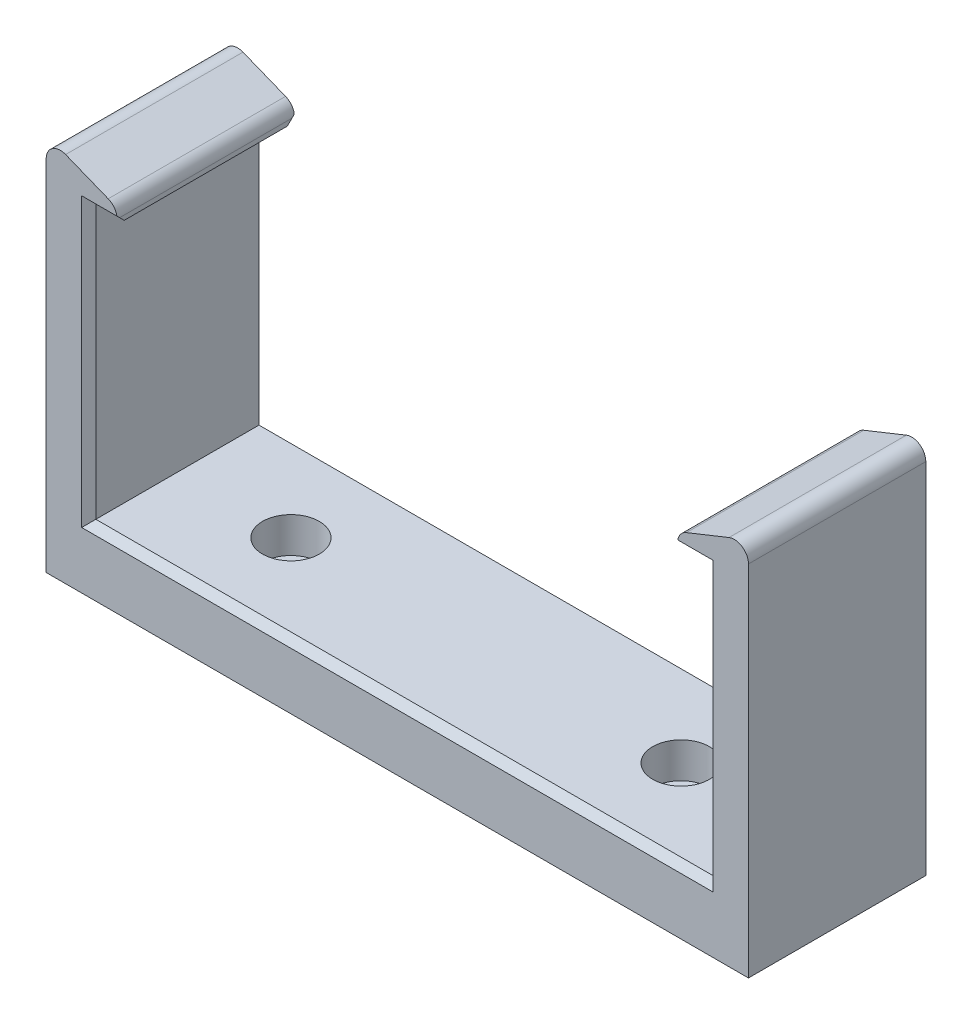
ISO-10303-21;
HEADER;
FILE_DESCRIPTION(('STEP AP214'),'2;1');
FILE_NAME('part.step','',(''),(''),'','','');
FILE_SCHEMA(('AUTOMOTIVE_DESIGN { 1 0 10303 214 1 1 1 1 }'));
ENDSEC;
DATA;
#1=APPLICATION_CONTEXT('core data for automotive mechanical design processes');
#2=APPLICATION_PROTOCOL_DEFINITION('international standard','automotive_design',2000,#1);
#3=PRODUCT_CONTEXT('',#1,'mechanical');
#4=PRODUCT('Part','Part','',(#3));
#5=PRODUCT_RELATED_PRODUCT_CATEGORY('part','',(#4));
#6=PRODUCT_DEFINITION_FORMATION('','',#4);
#7=PRODUCT_DEFINITION_CONTEXT('part definition',#1,'design');
#8=PRODUCT_DEFINITION('design','',#6,#7);
#9=PRODUCT_DEFINITION_SHAPE('','',#8);
#10=(LENGTH_UNIT() NAMED_UNIT(*) SI_UNIT(.MILLI.,.METRE.));
#11=(NAMED_UNIT(*) PLANE_ANGLE_UNIT() SI_UNIT($,.RADIAN.));
#12=(NAMED_UNIT(*) SI_UNIT($,.STERADIAN.) SOLID_ANGLE_UNIT());
#13=UNCERTAINTY_MEASURE_WITH_UNIT(LENGTH_MEASURE(1.E-05),#10,'distance_accuracy_value','');
#14=(GEOMETRIC_REPRESENTATION_CONTEXT(3) GLOBAL_UNCERTAINTY_ASSIGNED_CONTEXT((#13)) GLOBAL_UNIT_ASSIGNED_CONTEXT((#10,
#11,#12)) REPRESENTATION_CONTEXT('',''));
#15=CARTESIAN_POINT('',(0.,0.,0.));
#16=DIRECTION('',(0.,0.,1.));
#17=DIRECTION('',(1.,0.,0.));
#18=AXIS2_PLACEMENT_3D('',#15,#16,#17);
#19=CARTESIAN_POINT('',(0.,0.,25.));
#20=DIRECTION('',(0.,-1.,0.));
#21=DIRECTION('',(1.,0.,0.));
#22=AXIS2_PLACEMENT_3D('',#19,#20,#21);
#23=PLANE('',#22);
#24=CARTESIAN_POINT('',(16.,0.,12.5));
#25=DIRECTION('',(0.,1.,0.));
#26=DIRECTION('',(-1.,0.,0.));
#27=AXIS2_PLACEMENT_3D('',#24,#25,#26);
#28=CIRCLE('',#27,4.);
#29=CARTESIAN_POINT('',(12.,0.,12.5));
#30=VERTEX_POINT('',#29);
#31=EDGE_CURVE('E1071',#30,#30,#28,.T.);
#32=ORIENTED_EDGE('',*,*,#31,.F.);
#33=EDGE_LOOP('',(#32));
#34=FACE_BOUND('',#33,.T.);
#35=DIRECTION('',(0.,0.,-1.));
#36=VECTOR('',#35,1.);
#37=CARTESIAN_POINT('',(0.,0.,25.));
#38=LINE('',#37,#36);
#39=CARTESIAN_POINT('',(0.,0.,24.));
#40=VERTEX_POINT('',#39);
#41=CARTESIAN_POINT('',(0.,0.,1.00000000000001));
#42=VERTEX_POINT('',#41);
#43=EDGE_CURVE('E290',#40,#42,#38,.T.);
#44=ORIENTED_EDGE('',*,*,#43,.F.);
#45=DIRECTION('',(1.,0.,0.));
#46=VECTOR('',#45,1.);
#47=CARTESIAN_POINT('',(0.,0.,24.));
#48=LINE('',#47,#46);
#49=CARTESIAN_POINT('',(87.,0.,24.));
#50=VERTEX_POINT('',#49);
#51=EDGE_CURVE('E429',#40,#50,#48,.T.);
#52=ORIENTED_EDGE('',*,*,#51,.T.);
#53=DIRECTION('',(0.,0.,-1.));
#54=VECTOR('',#53,1.);
#55=CARTESIAN_POINT('',(87.,0.,25.));
#56=LINE('',#55,#54);
#57=CARTESIAN_POINT('',(87.,0.,1.00000000000001));
#58=VERTEX_POINT('',#57);
#59=EDGE_CURVE('E294',#50,#58,#56,.T.);
#60=ORIENTED_EDGE('',*,*,#59,.T.);
#61=DIRECTION('',(-1.,0.,0.));
#62=VECTOR('',#61,1.);
#63=CARTESIAN_POINT('',(0.,0.,1.00000000000001));
#64=LINE('',#63,#62);
#65=EDGE_CURVE('E426',#58,#42,#64,.T.);
#66=ORIENTED_EDGE('',*,*,#65,.T.);
#67=EDGE_LOOP('',(#44,#52,#60,#66));
#68=FACE_BOUND('',#67,.T.);
#69=CARTESIAN_POINT('',(71.,0.,12.5));
#70=DIRECTION('',(0.,1.,0.));
#71=DIRECTION('',(-1.,0.,0.));
#72=AXIS2_PLACEMENT_3D('',#69,#70,#71);
#73=CIRCLE('',#72,3.99999999999999);
#74=CARTESIAN_POINT('',(67.,0.,12.5));
#75=VERTEX_POINT('',#74);
#76=EDGE_CURVE('E479',#75,#75,#73,.F.);
#77=ORIENTED_EDGE('',*,*,#76,.T.);
#78=EDGE_LOOP('',(#77));
#79=FACE_BOUND('',#78,.T.);
#80=ADVANCED_FACE('F53',(#34,#68,#79),#23,.F.);
#81=CARTESIAN_POINT('',(71.,-10.,12.5));
#82=DIRECTION('',(0.,1.,0.));
#83=DIRECTION('',(-1.,0.,0.));
#84=AXIS2_PLACEMENT_3D('',#81,#82,#83);
#85=CYLINDRICAL_SURFACE('',#84,2.1);
#86=CARTESIAN_POINT('',(71.,-10.,12.5));
#87=DIRECTION('',(0.,1.,0.));
#88=DIRECTION('',(-1.,0.,0.));
#89=AXIS2_PLACEMENT_3D('',#86,#87,#88);
#90=CIRCLE('',#89,2.1);
#91=CARTESIAN_POINT('',(68.9,-10.,12.5));
#92=VERTEX_POINT('',#91);
#93=EDGE_CURVE('E528',#92,#92,#90,.F.);
#94=ORIENTED_EDGE('',*,*,#93,.T.);
#95=EDGE_LOOP('',(#94));
#96=FACE_BOUND('',#95,.T.);
#97=CARTESIAN_POINT('',(71.,-4.99999999999995,12.5));
#98=DIRECTION('',(0.,1.,0.));
#99=DIRECTION('',(-1.,0.,0.));
#100=AXIS2_PLACEMENT_3D('',#97,#98,#99);
#101=CIRCLE('',#100,2.1);
#102=CARTESIAN_POINT('',(68.9,-4.99999999999996,12.5));
#103=VERTEX_POINT('',#102);
#104=EDGE_CURVE('E1079',#103,#103,#101,.F.);
#105=ORIENTED_EDGE('',*,*,#104,.F.);
#106=EDGE_LOOP('',(#105));
#107=FACE_BOUND('',#106,.T.);
#108=ADVANCED_FACE('F657',(#96,#107),#85,.F.);
#109=CARTESIAN_POINT('',(16.,-10.,12.5));
#110=DIRECTION('',(0.,1.,0.));
#111=DIRECTION('',(-1.,0.,0.));
#112=AXIS2_PLACEMENT_3D('',#109,#110,#111);
#113=CYLINDRICAL_SURFACE('',#112,2.1);
#114=CARTESIAN_POINT('',(16.,-10.,12.5));
#115=DIRECTION('',(0.,1.,0.));
#116=DIRECTION('',(-1.,0.,0.));
#117=AXIS2_PLACEMENT_3D('',#114,#115,#116);
#118=CIRCLE('',#117,2.1);
#119=CARTESIAN_POINT('',(13.9,-10.,12.5));
#120=VERTEX_POINT('',#119);
#121=EDGE_CURVE('E282',#120,#120,#118,.T.);
#122=ORIENTED_EDGE('',*,*,#121,.F.);
#123=EDGE_LOOP('',(#122));
#124=FACE_BOUND('',#123,.T.);
#125=CARTESIAN_POINT('',(16.,-4.99999999999999,12.5));
#126=DIRECTION('',(0.,1.,0.));
#127=DIRECTION('',(-1.,0.,0.));
#128=AXIS2_PLACEMENT_3D('',#125,#126,#127);
#129=CIRCLE('',#128,2.1);
#130=CARTESIAN_POINT('',(13.9,-4.99999999999999,12.5));
#131=VERTEX_POINT('',#130);
#132=EDGE_CURVE('E1069',#131,#131,#129,.T.);
#133=ORIENTED_EDGE('',*,*,#132,.T.);
#134=EDGE_LOOP('',(#133));
#135=FACE_BOUND('',#134,.T.);
#136=ADVANCED_FACE('F523',(#124,#135),#113,.F.);
#137=CARTESIAN_POINT('',(87.,-9.99999999999994,25.));
#138=DIRECTION('',(0.,1.,0.));
#139=DIRECTION('',(0.,0.,1.));
#140=AXIS2_PLACEMENT_3D('',#137,#138,#139);
#141=PLANE('',#140);
#142=DIRECTION('',(1.,0.,0.));
#143=VECTOR('',#142,1.);
#144=CARTESIAN_POINT('',(93.,-9.99999999999994,0.999999999999959));
#145=LINE('',#144,#143);
#146=CARTESIAN_POINT('',(-5.00000000000005,-9.99999999999994,0.999999999999959));
#147=VERTEX_POINT('',#146);
#148=CARTESIAN_POINT('',(92.,-9.99999999999994,0.999999999999959));
#149=VERTEX_POINT('',#148);
#150=EDGE_CURVE('E72',#147,#149,#145,.T.);
#151=ORIENTED_EDGE('',*,*,#150,.T.);
#152=DIRECTION('',(0.,0.,1.));
#153=VECTOR('',#152,1.);
#154=CARTESIAN_POINT('',(92.,-9.99999999999994,25.));
#155=LINE('',#154,#153);
#156=CARTESIAN_POINT('',(92.,-9.99999999999994,24.));
#157=VERTEX_POINT('',#156);
#158=EDGE_CURVE('E64',#149,#157,#155,.T.);
#159=ORIENTED_EDGE('',*,*,#158,.T.);
#160=DIRECTION('',(-1.,0.,0.));
#161=VECTOR('',#160,1.);
#162=CARTESIAN_POINT('',(87.,-9.99999999999994,24.));
#163=LINE('',#162,#161);
#164=CARTESIAN_POINT('',(-5.00000000000005,-9.99999999999994,24.));
#165=VERTEX_POINT('',#164);
#166=EDGE_CURVE('E453',#157,#165,#163,.T.);
#167=ORIENTED_EDGE('',*,*,#166,.T.);
#168=DIRECTION('',(0.,0.,-1.));
#169=VECTOR('',#168,1.);
#170=CARTESIAN_POINT('',(-5.00000000000005,-9.99999999999994,25.));
#171=LINE('',#170,#169);
#172=EDGE_CURVE('E79',#165,#147,#171,.T.);
#173=ORIENTED_EDGE('',*,*,#172,.T.);
#174=EDGE_LOOP('',(#151,#159,#167,#173));
#175=FACE_BOUND('',#174,.T.);
#176=ORIENTED_EDGE('',*,*,#93,.F.);
#177=EDGE_LOOP('',(#176));
#178=FACE_BOUND('',#177,.T.);
#179=ORIENTED_EDGE('',*,*,#121,.T.);
#180=EDGE_LOOP('',(#179));
#181=FACE_BOUND('',#180,.T.);
#182=ADVANCED_FACE('F519',(#175,#178,#181),#141,.F.);
#183=CARTESIAN_POINT('',(0.,0.,25.));
#184=DIRECTION('',(-1.,0.,0.));
#185=DIRECTION('',(0.,-1.,0.));
#186=AXIS2_PLACEMENT_3D('',#183,#184,#185);
#187=PLANE('',#186);
#188=DIRECTION('',(0.,0.,-1.));
#189=VECTOR('',#188,1.);
#190=CARTESIAN_POINT('',(0.,38.5,25.));
#191=LINE('',#190,#189);
#192=CARTESIAN_POINT('',(0.,38.5,24.));
#193=VERTEX_POINT('',#192);
#194=CARTESIAN_POINT('',(0.,38.5,1.00000000000001));
#195=VERTEX_POINT('',#194);
#196=EDGE_CURVE('E265',#193,#195,#191,.T.);
#197=ORIENTED_EDGE('',*,*,#196,.F.);
#198=DIRECTION('',(0.,-1.,0.));
#199=VECTOR('',#198,1.);
#200=CARTESIAN_POINT('',(0.,0.,24.));
#201=LINE('',#200,#199);
#202=EDGE_CURVE('E398',#193,#40,#201,.T.);
#203=ORIENTED_EDGE('',*,*,#202,.T.);
#204=ORIENTED_EDGE('',*,*,#43,.T.);
#205=DIRECTION('',(0.,1.,0.));
#206=VECTOR('',#205,1.);
#207=CARTESIAN_POINT('',(0.,38.5,1.00000000000001));
#208=LINE('',#207,#206);
#209=EDGE_CURVE('E395',#42,#195,#208,.T.);
#210=ORIENTED_EDGE('',*,*,#209,.T.);
#211=EDGE_LOOP('',(#197,#203,#204,#210));
#212=FACE_BOUND('',#211,.T.);
#213=ADVANCED_FACE('F522',(#212),#187,.F.);
#214=CARTESIAN_POINT('',(0.,38.5,25.));
#215=DIRECTION('',(0.,1.,0.));
#216=DIRECTION('',(-1.,0.,0.));
#217=AXIS2_PLACEMENT_3D('',#214,#215,#216);
#218=PLANE('',#217);
#219=DIRECTION('',(0.,0.,-1.));
#220=VECTOR('',#219,1.);
#221=CARTESIAN_POINT('',(4.,38.5,25.));
#222=LINE('',#221,#220);
#223=CARTESIAN_POINT('',(4.,38.5,24.));
#224=VERTEX_POINT('',#223);
#225=CARTESIAN_POINT('',(4.,38.5,1.00000000000001));
#226=VERTEX_POINT('',#225);
#227=EDGE_CURVE('E307',#224,#226,#222,.T.);
#228=ORIENTED_EDGE('',*,*,#227,.F.);
#229=DIRECTION('',(-1.,0.,0.));
#230=VECTOR('',#229,1.);
#231=CARTESIAN_POINT('',(0.,38.5,24.));
#232=LINE('',#231,#230);
#233=EDGE_CURVE('E392',#224,#193,#232,.T.);
#234=ORIENTED_EDGE('',*,*,#233,.T.);
#235=ORIENTED_EDGE('',*,*,#196,.T.);
#236=DIRECTION('',(1.,0.,0.));
#237=VECTOR('',#236,1.);
#238=CARTESIAN_POINT('',(4.,38.5,1.00000000000001));
#239=LINE('',#238,#237);
#240=EDGE_CURVE('E390',#195,#226,#239,.T.);
#241=ORIENTED_EDGE('',*,*,#240,.T.);
#242=EDGE_LOOP('',(#228,#234,#235,#241));
#243=FACE_BOUND('',#242,.T.);
#244=ADVANCED_FACE('F644',(#243),#218,.F.);
#245=CARTESIAN_POINT('',(4.,40.5,25.));
#246=DIRECTION('',(-1.,0.,0.));
#247=DIRECTION('',(0.,0.,1.));
#248=AXIS2_PLACEMENT_3D('',#245,#246,#247);
#249=PLANE('',#248);
#250=DIRECTION('',(0.,0.,-1.));
#251=VECTOR('',#250,1.);
#252=CARTESIAN_POINT('',(4.,39.1459340771462,25.));
#253=LINE('',#252,#251);
#254=CARTESIAN_POINT('',(4.,39.1459340771462,0.354065922853815));
#255=VERTEX_POINT('',#254);
#256=CARTESIAN_POINT('',(4.,39.1459340771462,24.6459340771462));
#257=VERTEX_POINT('',#256);
#258=EDGE_CURVE('E355',#255,#257,#253,.F.);
#259=ORIENTED_EDGE('',*,*,#258,.T.);
#260=DIRECTION('',(0.,0.707106781186548,0.707106781186548));
#261=VECTOR('',#260,1.);
#262=CARTESIAN_POINT('',(4.,39.5,25.));
#263=LINE('',#262,#261);
#264=EDGE_CURVE('E387',#257,#224,#263,.F.);
#265=ORIENTED_EDGE('',*,*,#264,.T.);
#266=ORIENTED_EDGE('',*,*,#227,.T.);
#267=DIRECTION('',(0.,0.707106781186548,-0.707106781186548));
#268=VECTOR('',#267,1.);
#269=CARTESIAN_POINT('',(4.,38.5,1.00000000000002));
#270=LINE('',#269,#268);
#271=EDGE_CURVE('E384',#226,#255,#270,.T.);
#272=ORIENTED_EDGE('',*,*,#271,.T.);
#273=EDGE_LOOP('',(#259,#265,#266,#272));
#274=FACE_BOUND('',#273,.T.);
#275=ADVANCED_FACE('F646',(#274),#249,.F.);
#276=CARTESIAN_POINT('',(-6.,44.5,25.));
#277=DIRECTION('',(-0.371390676354103,-0.928476690885259,0.));
#278=DIRECTION('',(0.92847669088526,-0.371390676354104,0.));
#279=AXIS2_PLACEMENT_3D('',#276,#277,#278);
#280=PLANE('',#279);
#281=DIRECTION('',(-0.928476690885259,0.371390676354103,0.));
#282=VECTOR('',#281,1.);
#283=CARTESIAN_POINT('',(-6.,44.5,0.));
#284=LINE('',#283,#282);
#285=CARTESIAN_POINT('',(2.74278135270821,41.0028874589167,0.));
#286=VERTEX_POINT('',#285);
#287=CARTESIAN_POINT('',(-3.2572186472918,43.4028874589167,0.));
#288=VERTEX_POINT('',#287);
#289=EDGE_CURVE('E273',#286,#288,#284,.T.);
#290=ORIENTED_EDGE('',*,*,#289,.T.);
#291=DIRECTION('',(0.,0.,-1.));
#292=VECTOR('',#291,1.);
#293=CARTESIAN_POINT('',(-3.25721864729179,43.4028874589167,25.));
#294=LINE('',#293,#292);
#295=CARTESIAN_POINT('',(-3.2572186472918,43.4028874589167,25.));
#296=VERTEX_POINT('',#295);
#297=EDGE_CURVE('E246',#288,#296,#294,.F.);
#298=ORIENTED_EDGE('',*,*,#297,.T.);
#299=DIRECTION('',(-0.928476690885259,0.371390676354103,0.));
#300=VECTOR('',#299,1.);
#301=CARTESIAN_POINT('',(-6.,44.5,25.));
#302=LINE('',#301,#300);
#303=CARTESIAN_POINT('',(2.74278135270821,41.0028874589167,25.));
#304=VERTEX_POINT('',#303);
#305=EDGE_CURVE('E289',#304,#296,#302,.T.);
#306=ORIENTED_EDGE('',*,*,#305,.F.);
#307=DIRECTION('',(0.,0.,-1.));
#308=VECTOR('',#307,1.);
#309=CARTESIAN_POINT('',(2.74278135270821,41.0028874589167,25.));
#310=LINE('',#309,#308);
#311=EDGE_CURVE('E252',#304,#286,#310,.T.);
#312=ORIENTED_EDGE('',*,*,#311,.T.);
#313=EDGE_LOOP('',(#290,#298,#306,#312));
#314=FACE_BOUND('',#313,.T.);
#315=ADVANCED_FACE('F595',(#314),#280,.F.);
#316=CARTESIAN_POINT('',(-6.,-10.,25.));
#317=DIRECTION('',(1.,0.,0.));
#318=DIRECTION('',(0.,0.,-1.));
#319=AXIS2_PLACEMENT_3D('',#316,#317,#318);
#320=PLANE('',#319);
#321=DIRECTION('',(0.,-1.,0.));
#322=VECTOR('',#321,1.);
#323=CARTESIAN_POINT('',(-6.,-10.,0.));
#324=LINE('',#323,#322);
#325=CARTESIAN_POINT('',(-6.,41.5459340771462,0.));
#326=VERTEX_POINT('',#325);
#327=CARTESIAN_POINT('',(-6.,-8.99999999999999,0.));
#328=VERTEX_POINT('',#327);
#329=EDGE_CURVE('E259',#326,#328,#324,.T.);
#330=ORIENTED_EDGE('',*,*,#329,.T.);
#331=DIRECTION('',(0.,0.,1.));
#332=VECTOR('',#331,1.);
#333=CARTESIAN_POINT('',(-6.,-8.99999999999999,25.));
#334=LINE('',#333,#332);
#335=CARTESIAN_POINT('',(-6.,-8.99999999999999,25.));
#336=VERTEX_POINT('',#335);
#337=EDGE_CURVE('E11',#328,#336,#334,.T.);
#338=ORIENTED_EDGE('',*,*,#337,.T.);
#339=DIRECTION('',(0.,-1.,0.));
#340=VECTOR('',#339,1.);
#341=CARTESIAN_POINT('',(-6.,38.5,25.));
#342=LINE('',#341,#340);
#343=CARTESIAN_POINT('',(-6.,41.5459340771462,25.));
#344=VERTEX_POINT('',#343);
#345=EDGE_CURVE('E262',#344,#336,#342,.T.);
#346=ORIENTED_EDGE('',*,*,#345,.F.);
#347=DIRECTION('',(0.,0.,-1.));
#348=VECTOR('',#347,1.);
#349=CARTESIAN_POINT('',(-6.,41.5459340771462,25.));
#350=LINE('',#349,#348);
#351=EDGE_CURVE('E245',#344,#326,#350,.T.);
#352=ORIENTED_EDGE('',*,*,#351,.T.);
#353=EDGE_LOOP('',(#330,#338,#346,#352));
#354=FACE_BOUND('',#353,.T.);
#355=ADVANCED_FACE('F258',(#354),#320,.F.);
#356=CARTESIAN_POINT('',(93.,38.5,25.));
#357=DIRECTION('',(-1.,0.,0.));
#358=DIRECTION('',(0.,0.,1.));
#359=AXIS2_PLACEMENT_3D('',#356,#357,#358);
#360=PLANE('',#359);
#361=DIRECTION('',(0.,1.,0.));
#362=VECTOR('',#361,1.);
#363=CARTESIAN_POINT('',(93.,-9.99999999999994,25.));
#364=LINE('',#363,#362);
#365=CARTESIAN_POINT('',(93.,-8.99999999999999,25.));
#366=VERTEX_POINT('',#365);
#367=CARTESIAN_POINT('',(93.,41.5459340771462,25.));
#368=VERTEX_POINT('',#367);
#369=EDGE_CURVE('E546',#366,#368,#364,.T.);
#370=ORIENTED_EDGE('',*,*,#369,.F.);
#371=DIRECTION('',(0.,0.,-1.));
#372=VECTOR('',#371,1.);
#373=CARTESIAN_POINT('',(93.,-8.99999999999999,25.));
#374=LINE('',#373,#372);
#375=CARTESIAN_POINT('',(93.,-8.99999999999999,0.));
#376=VERTEX_POINT('',#375);
#377=EDGE_CURVE('E449',#366,#376,#374,.T.);
#378=ORIENTED_EDGE('',*,*,#377,.T.);
#379=DIRECTION('',(0.,1.,0.));
#380=VECTOR('',#379,1.);
#381=CARTESIAN_POINT('',(93.,38.5,0.));
#382=LINE('',#381,#380);
#383=CARTESIAN_POINT('',(93.,41.5459340771462,0.));
#384=VERTEX_POINT('',#383);
#385=EDGE_CURVE('E272',#376,#384,#382,.T.);
#386=ORIENTED_EDGE('',*,*,#385,.T.);
#387=DIRECTION('',(0.,0.,-1.));
#388=VECTOR('',#387,1.);
#389=CARTESIAN_POINT('',(93.,41.5459340771462,25.));
#390=LINE('',#389,#388);
#391=EDGE_CURVE('E347',#384,#368,#390,.F.);
#392=ORIENTED_EDGE('',*,*,#391,.T.);
#393=EDGE_LOOP('',(#370,#378,#386,#392));
#394=FACE_BOUND('',#393,.T.);
#395=ADVANCED_FACE('F678',(#394),#360,.F.);
#396=CARTESIAN_POINT('',(93.,44.5,25.));
#397=DIRECTION('',(0.371390676354104,-0.928476690885259,0.));
#398=DIRECTION('',(0.92847669088526,0.371390676354104,0.));
#399=AXIS2_PLACEMENT_3D('',#396,#397,#398);
#400=PLANE('',#399);
#401=DIRECTION('',(-0.928476690885259,-0.371390676354104,0.));
#402=VECTOR('',#401,1.);
#403=CARTESIAN_POINT('',(93.,44.5,25.));
#404=LINE('',#403,#402);
#405=CARTESIAN_POINT('',(90.2572186472918,43.4028874589168,25.));
#406=VERTEX_POINT('',#405);
#407=CARTESIAN_POINT('',(84.2572186472918,41.0028874589168,25.));
#408=VERTEX_POINT('',#407);
#409=EDGE_CURVE('E295',#406,#408,#404,.T.);
#410=ORIENTED_EDGE('',*,*,#409,.F.);
#411=DIRECTION('',(0.,0.,-1.));
#412=VECTOR('',#411,1.);
#413=CARTESIAN_POINT('',(90.2572186472918,43.4028874589168,25.));
#414=LINE('',#413,#412);
#415=CARTESIAN_POINT('',(90.2572186472918,43.4028874589168,0.));
#416=VERTEX_POINT('',#415);
#417=EDGE_CURVE('E343',#406,#416,#414,.T.);
#418=ORIENTED_EDGE('',*,*,#417,.T.);
#419=DIRECTION('',(-0.928476690885259,-0.371390676354104,0.));
#420=VECTOR('',#419,1.);
#421=CARTESIAN_POINT('',(93.,44.5,0.));
#422=LINE('',#421,#420);
#423=CARTESIAN_POINT('',(84.2572186472918,41.0028874589168,0.));
#424=VERTEX_POINT('',#423);
#425=EDGE_CURVE('E279',#416,#424,#422,.T.);
#426=ORIENTED_EDGE('',*,*,#425,.T.);
#427=DIRECTION('',(0.,0.,-1.));
#428=VECTOR('',#427,1.);
#429=CARTESIAN_POINT('',(84.2572186472918,41.0028874589168,25.));
#430=LINE('',#429,#428);
#431=EDGE_CURVE('E340',#424,#408,#430,.F.);
#432=ORIENTED_EDGE('',*,*,#431,.T.);
#433=EDGE_LOOP('',(#410,#418,#426,#432));
#434=FACE_BOUND('',#433,.T.);
#435=ADVANCED_FACE('F675',(#434),#400,.F.);
#436=CARTESIAN_POINT('',(83.,40.5,25.));
#437=DIRECTION('',(1.,0.,0.));
#438=DIRECTION('',(0.,0.,-1.));
#439=AXIS2_PLACEMENT_3D('',#436,#437,#438);
#440=PLANE('',#439);
#441=DIRECTION('',(0.,0.,-1.));
#442=VECTOR('',#441,1.);
#443=CARTESIAN_POINT('',(83.,38.5,25.));
#444=LINE('',#443,#442);
#445=CARTESIAN_POINT('',(83.,38.5,24.));
#446=VERTEX_POINT('',#445);
#447=CARTESIAN_POINT('',(83.,38.5,1.00000000000001));
#448=VERTEX_POINT('',#447);
#449=EDGE_CURVE('E303',#446,#448,#444,.T.);
#450=ORIENTED_EDGE('',*,*,#449,.F.);
#451=DIRECTION('',(0.,-0.707106781186548,-0.707106781186547));
#452=VECTOR('',#451,1.);
#453=CARTESIAN_POINT('',(83.,39.5000000000001,25.0000000000001));
#454=LINE('',#453,#452);
#455=CARTESIAN_POINT('',(83.,39.1459340771462,24.6459340771462));
#456=VERTEX_POINT('',#455);
#457=EDGE_CURVE('E411',#446,#456,#454,.F.);
#458=ORIENTED_EDGE('',*,*,#457,.T.);
#459=DIRECTION('',(0.,0.,-1.));
#460=VECTOR('',#459,1.);
#461=CARTESIAN_POINT('',(83.,39.1459340771462,25.));
#462=LINE('',#461,#460);
#463=CARTESIAN_POINT('',(83.,39.1459340771462,0.354065922853811));
#464=VERTEX_POINT('',#463);
#465=EDGE_CURVE('E351',#456,#464,#462,.T.);
#466=ORIENTED_EDGE('',*,*,#465,.T.);
#467=DIRECTION('',(0.,-0.707106781186548,0.707106781186547));
#468=VECTOR('',#467,1.);
#469=CARTESIAN_POINT('',(83.,38.5,1.00000000000002));
#470=LINE('',#469,#468);
#471=EDGE_CURVE('E408',#464,#448,#470,.T.);
#472=ORIENTED_EDGE('',*,*,#471,.T.);
#473=EDGE_LOOP('',(#450,#458,#466,#472));
#474=FACE_BOUND('',#473,.T.);
#475=ADVANCED_FACE('F627',(#474),#440,.F.);
#476=CARTESIAN_POINT('',(87.,38.5,25.));
#477=DIRECTION('',(0.,1.,0.));
#478=DIRECTION('',(-1.,0.,0.));
#479=AXIS2_PLACEMENT_3D('',#476,#477,#478);
#480=PLANE('',#479);
#481=DIRECTION('',(0.,0.,-1.));
#482=VECTOR('',#481,1.);
#483=CARTESIAN_POINT('',(87.,38.5,25.));
#484=LINE('',#483,#482);
#485=CARTESIAN_POINT('',(87.,38.5,24.));
#486=VERTEX_POINT('',#485);
#487=CARTESIAN_POINT('',(87.,38.5,1.00000000000001));
#488=VERTEX_POINT('',#487);
#489=EDGE_CURVE('E299',#486,#488,#484,.T.);
#490=ORIENTED_EDGE('',*,*,#489,.F.);
#491=DIRECTION('',(-1.,0.,0.));
#492=VECTOR('',#491,1.);
#493=CARTESIAN_POINT('',(87.,38.5,24.));
#494=LINE('',#493,#492);
#495=EDGE_CURVE('E405',#486,#446,#494,.T.);
#496=ORIENTED_EDGE('',*,*,#495,.T.);
#497=ORIENTED_EDGE('',*,*,#449,.T.);
#498=DIRECTION('',(1.,0.,0.));
#499=VECTOR('',#498,1.);
#500=CARTESIAN_POINT('',(87.,38.5,1.00000000000001));
#501=LINE('',#500,#499);
#502=EDGE_CURVE('E401',#448,#488,#501,.T.);
#503=ORIENTED_EDGE('',*,*,#502,.T.);
#504=EDGE_LOOP('',(#490,#496,#497,#503));
#505=FACE_BOUND('',#504,.T.);
#506=ADVANCED_FACE('F630',(#505),#480,.F.);
#507=CARTESIAN_POINT('',(87.,0.,25.));
#508=DIRECTION('',(1.,0.,0.));
#509=DIRECTION('',(0.,0.,-1.));
#510=AXIS2_PLACEMENT_3D('',#507,#508,#509);
#511=PLANE('',#510);
#512=ORIENTED_EDGE('',*,*,#59,.F.);
#513=DIRECTION('',(0.,1.,0.));
#514=VECTOR('',#513,1.);
#515=CARTESIAN_POINT('',(87.,0.,24.));
#516=LINE('',#515,#514);
#517=EDGE_CURVE('E423',#50,#486,#516,.T.);
#518=ORIENTED_EDGE('',*,*,#517,.T.);
#519=ORIENTED_EDGE('',*,*,#489,.T.);
#520=DIRECTION('',(0.,-1.,0.));
#521=VECTOR('',#520,1.);
#522=CARTESIAN_POINT('',(87.,0.,1.00000000000001));
#523=LINE('',#522,#521);
#524=EDGE_CURVE('E420',#488,#58,#523,.T.);
#525=ORIENTED_EDGE('',*,*,#524,.T.);
#526=EDGE_LOOP('',(#512,#518,#519,#525));
#527=FACE_BOUND('',#526,.T.);
#528=ADVANCED_FACE('F633',(#527),#511,.F.);
#529=CARTESIAN_POINT('',(0.,0.,25.));
#530=DIRECTION('',(0.,0.,-1.));
#531=DIRECTION('',(-1.,0.,0.));
#532=AXIS2_PLACEMENT_3D('',#529,#530,#531);
#533=PLANE('',#532);
#534=DIRECTION('',(0.,1.,0.));
#535=VECTOR('',#534,1.);
#536=CARTESIAN_POINT('',(-1.00000000000001,0.,25.));
#537=LINE('',#536,#535);
#538=CARTESIAN_POINT('',(-1.00000000000001,-1.00000000000002,25.));
#539=VERTEX_POINT('',#538);
#540=CARTESIAN_POINT('',(-1.00000000000001,39.5,25.));
#541=VERTEX_POINT('',#540);
#542=EDGE_CURVE('E371',#539,#541,#537,.T.);
#543=ORIENTED_EDGE('',*,*,#542,.T.);
#544=DIRECTION('',(1.,0.,0.));
#545=VECTOR('',#544,1.);
#546=CARTESIAN_POINT('',(0.,39.5,25.));
#547=LINE('',#546,#545);
#548=CARTESIAN_POINT('',(3.96840984611277,39.5,25.));
#549=VERTEX_POINT('',#548);
#550=EDGE_CURVE('E374',#541,#549,#547,.T.);
#551=ORIENTED_EDGE('',*,*,#550,.T.);
#552=CARTESIAN_POINT('',(2.,39.1459340771462,25.));
#553=DIRECTION('',(0.,0.,-1.));
#554=DIRECTION('',(-1.,0.,0.));
#555=AXIS2_PLACEMENT_3D('',#552,#553,#554);
#556=CIRCLE('',#555,2.);
#557=EDGE_CURVE('E327',#549,#304,#556,.F.);
#558=ORIENTED_EDGE('',*,*,#557,.T.);
#559=ORIENTED_EDGE('',*,*,#305,.T.);
#560=CARTESIAN_POINT('',(-4.,41.5459340771462,25.));
#561=DIRECTION('',(0.,0.,-1.));
#562=DIRECTION('',(-1.,0.,0.));
#563=AXIS2_PLACEMENT_3D('',#560,#561,#562);
#564=CIRCLE('',#563,2.);
#565=EDGE_CURVE('E337',#296,#344,#564,.F.);
#566=ORIENTED_EDGE('',*,*,#565,.T.);
#567=ORIENTED_EDGE('',*,*,#345,.T.);
#568=DIRECTION('',(1.,0.,0.));
#569=VECTOR('',#568,1.);
#570=CARTESIAN_POINT('',(0.,-8.99999999999999,25.));
#571=LINE('',#570,#569);
#572=EDGE_CURVE('E359',#336,#366,#571,.T.);
#573=ORIENTED_EDGE('',*,*,#572,.T.);
#574=ORIENTED_EDGE('',*,*,#369,.T.);
#575=CARTESIAN_POINT('',(91.,41.5459340771462,25.));
#576=DIRECTION('',(0.,0.,-1.));
#577=DIRECTION('',(-1.,0.,0.));
#578=AXIS2_PLACEMENT_3D('',#575,#576,#577);
#579=CIRCLE('',#578,2.);
#580=EDGE_CURVE('E334',#368,#406,#579,.F.);
#581=ORIENTED_EDGE('',*,*,#580,.T.);
#582=ORIENTED_EDGE('',*,*,#409,.T.);
#583=CARTESIAN_POINT('',(85.,39.1459340771462,25.));
#584=DIRECTION('',(0.,0.,-1.));
#585=DIRECTION('',(-1.,0.,0.));
#586=AXIS2_PLACEMENT_3D('',#583,#584,#585);
#587=CIRCLE('',#586,2.);
#588=CARTESIAN_POINT('',(83.0315901538872,39.5000000000001,25.));
#589=VERTEX_POINT('',#588);
#590=EDGE_CURVE('E330',#408,#589,#587,.F.);
#591=ORIENTED_EDGE('',*,*,#590,.T.);
#592=DIRECTION('',(1.,0.,0.));
#593=VECTOR('',#592,1.);
#594=CARTESIAN_POINT('',(0.,39.5000000000002,25.));
#595=LINE('',#594,#593);
#596=CARTESIAN_POINT('',(88.,39.5,25.));
#597=VERTEX_POINT('',#596);
#598=EDGE_CURVE('E368',#589,#597,#595,.T.);
#599=ORIENTED_EDGE('',*,*,#598,.T.);
#600=DIRECTION('',(0.,-1.,0.));
#601=VECTOR('',#600,1.);
#602=CARTESIAN_POINT('',(88.,0.,25.));
#603=LINE('',#602,#601);
#604=CARTESIAN_POINT('',(88.,-0.999999999999959,25.));
#605=VERTEX_POINT('',#604);
#606=EDGE_CURVE('E365',#597,#605,#603,.T.);
#607=ORIENTED_EDGE('',*,*,#606,.T.);
#608=DIRECTION('',(-1.,0.,0.));
#609=VECTOR('',#608,1.);
#610=CARTESIAN_POINT('',(0.,-1.00000000000001,25.));
#611=LINE('',#610,#609);
#612=EDGE_CURVE('E362',#605,#539,#611,.T.);
#613=ORIENTED_EDGE('',*,*,#612,.T.);
#614=EDGE_LOOP('',(#543,#551,#558,#559,#566,#567,#573,#574,#581,#582,#591,#599,#607,#613));
#615=FACE_BOUND('',#614,.T.);
#616=ADVANCED_FACE('F555',(#615),#533,.F.);
#617=CARTESIAN_POINT('',(0.,0.,0.));
#618=DIRECTION('',(0.,0.,-1.));
#619=DIRECTION('',(-1.,0.,0.));
#620=AXIS2_PLACEMENT_3D('',#617,#618,#619);
#621=PLANE('',#620);
#622=DIRECTION('',(0.,1.,0.));
#623=VECTOR('',#622,1.);
#624=CARTESIAN_POINT('',(88.,38.5,0.));
#625=LINE('',#624,#623);
#626=CARTESIAN_POINT('',(88.,-0.999999999999959,0.));
#627=VERTEX_POINT('',#626);
#628=CARTESIAN_POINT('',(88.,39.5,0.));
#629=VERTEX_POINT('',#628);
#630=EDGE_CURVE('E443',#627,#629,#625,.T.);
#631=ORIENTED_EDGE('',*,*,#630,.T.);
#632=DIRECTION('',(-1.,0.,0.));
#633=VECTOR('',#632,1.);
#634=CARTESIAN_POINT('',(83.,39.5000000000001,0.));
#635=LINE('',#634,#633);
#636=CARTESIAN_POINT('',(83.0315901538872,39.5000000000001,0.));
#637=VERTEX_POINT('',#636);
#638=EDGE_CURVE('E446',#629,#637,#635,.T.);
#639=ORIENTED_EDGE('',*,*,#638,.T.);
#640=CARTESIAN_POINT('',(85.,39.1459340771462,0.));
#641=DIRECTION('',(0.,0.,-1.));
#642=DIRECTION('',(-1.,0.,0.));
#643=AXIS2_PLACEMENT_3D('',#640,#641,#642);
#644=CIRCLE('',#643,2.);
#645=EDGE_CURVE('E317',#637,#424,#644,.T.);
#646=ORIENTED_EDGE('',*,*,#645,.T.);
#647=ORIENTED_EDGE('',*,*,#425,.F.);
#648=CARTESIAN_POINT('',(91.,41.5459340771462,0.));
#649=DIRECTION('',(0.,0.,-1.));
#650=DIRECTION('',(-1.,0.,0.));
#651=AXIS2_PLACEMENT_3D('',#648,#649,#650);
#652=CIRCLE('',#651,2.);
#653=EDGE_CURVE('E253',#416,#384,#652,.T.);
#654=ORIENTED_EDGE('',*,*,#653,.T.);
#655=ORIENTED_EDGE('',*,*,#385,.F.);
#656=DIRECTION('',(-1.,0.,0.));
#657=VECTOR('',#656,1.);
#658=CARTESIAN_POINT('',(-6.,-8.99999999999999,0.));
#659=LINE('',#658,#657);
#660=EDGE_CURVE('E270',#376,#328,#659,.T.);
#661=ORIENTED_EDGE('',*,*,#660,.T.);
#662=ORIENTED_EDGE('',*,*,#329,.F.);
#663=CARTESIAN_POINT('',(-4.,41.5459340771462,0.));
#664=DIRECTION('',(0.,0.,-1.));
#665=DIRECTION('',(-1.,0.,0.));
#666=AXIS2_PLACEMENT_3D('',#663,#664,#665);
#667=CIRCLE('',#666,2.);
#668=EDGE_CURVE('E241',#326,#288,#667,.T.);
#669=ORIENTED_EDGE('',*,*,#668,.T.);
#670=ORIENTED_EDGE('',*,*,#289,.F.);
#671=CARTESIAN_POINT('',(2.,39.1459340771462,0.));
#672=DIRECTION('',(0.,0.,-1.));
#673=DIRECTION('',(-1.,0.,0.));
#674=AXIS2_PLACEMENT_3D('',#671,#672,#673);
#675=CIRCLE('',#674,2.);
#676=CARTESIAN_POINT('',(3.96840984611277,39.5,0.));
#677=VERTEX_POINT('',#676);
#678=EDGE_CURVE('E264',#286,#677,#675,.T.);
#679=ORIENTED_EDGE('',*,*,#678,.T.);
#680=DIRECTION('',(-1.,0.,0.));
#681=VECTOR('',#680,1.);
#682=CARTESIAN_POINT('',(0.,39.5,0.));
#683=LINE('',#682,#681);
#684=CARTESIAN_POINT('',(-1.00000000000001,39.5,0.));
#685=VERTEX_POINT('',#684);
#686=EDGE_CURVE('E437',#677,#685,#683,.T.);
#687=ORIENTED_EDGE('',*,*,#686,.T.);
#688=DIRECTION('',(0.,-1.,0.));
#689=VECTOR('',#688,1.);
#690=CARTESIAN_POINT('',(-1.00000000000001,0.,0.));
#691=LINE('',#690,#689);
#692=CARTESIAN_POINT('',(-1.00000000000001,-1.00000000000002,0.));
#693=VERTEX_POINT('',#692);
#694=EDGE_CURVE('E434',#685,#693,#691,.T.);
#695=ORIENTED_EDGE('',*,*,#694,.T.);
#696=DIRECTION('',(1.,0.,0.));
#697=VECTOR('',#696,1.);
#698=CARTESIAN_POINT('',(87.,-0.999999999999959,0.));
#699=LINE('',#698,#697);
#700=EDGE_CURVE('E440',#693,#627,#699,.T.);
#701=ORIENTED_EDGE('',*,*,#700,.T.);
#702=EDGE_LOOP('',(#631,#639,#646,#647,#654,#655,#661,#662,#669,#670,#679,#687,#695,#701));
#703=FACE_BOUND('',#702,.T.);
#704=ADVANCED_FACE('F267',(#703),#621,.T.);
#705=CARTESIAN_POINT('',(16.,-4.99999999999999,12.5));
#706=DIRECTION('',(0.,1.,0.));
#707=DIRECTION('',(-1.,0.,0.));
#708=AXIS2_PLACEMENT_3D('',#705,#706,#707);
#709=CYLINDRICAL_SURFACE('',#708,4.);
#710=CARTESIAN_POINT('',(16.,-4.99999999999999,12.5));
#711=DIRECTION('',(0.,1.,0.));
#712=DIRECTION('',(-1.,0.,0.));
#713=AXIS2_PLACEMENT_3D('',#710,#711,#712);
#714=CIRCLE('',#713,4.);
#715=CARTESIAN_POINT('',(12.,-4.99999999999999,12.5));
#716=VERTEX_POINT('',#715);
#717=EDGE_CURVE('E536',#716,#716,#714,.T.);
#718=ORIENTED_EDGE('',*,*,#717,.F.);
#719=EDGE_LOOP('',(#718));
#720=FACE_BOUND('',#719,.T.);
#721=ORIENTED_EDGE('',*,*,#31,.T.);
#722=EDGE_LOOP('',(#721));
#723=FACE_BOUND('',#722,.T.);
#724=ADVANCED_FACE('F714',(#720,#723),#709,.F.);
#725=CARTESIAN_POINT('',(0.,-5.,0.));
#726=DIRECTION('',(0.,1.,0.));
#727=DIRECTION('',(-1.,0.,0.));
#728=AXIS2_PLACEMENT_3D('',#725,#726,#727);
#729=PLANE('',#728);
#730=ORIENTED_EDGE('',*,*,#132,.F.);
#731=EDGE_LOOP('',(#730));
#732=FACE_BOUND('',#731,.T.);
#733=ORIENTED_EDGE('',*,*,#717,.T.);
#734=EDGE_LOOP('',(#733));
#735=FACE_BOUND('',#734,.T.);
#736=ADVANCED_FACE('F721',(#732,#735),#729,.T.);
#737=CARTESIAN_POINT('',(71.,-4.99999999999995,12.5));
#738=DIRECTION('',(0.,1.,0.));
#739=DIRECTION('',(-1.,0.,0.));
#740=AXIS2_PLACEMENT_3D('',#737,#738,#739);
#741=CYLINDRICAL_SURFACE('',#740,3.99999999999999);
#742=CARTESIAN_POINT('',(71.,-4.99999999999995,12.5));
#743=DIRECTION('',(0.,1.,0.));
#744=DIRECTION('',(-1.,0.,0.));
#745=AXIS2_PLACEMENT_3D('',#742,#743,#744);
#746=CIRCLE('',#745,3.99999999999999);
#747=CARTESIAN_POINT('',(67.,-4.99999999999996,12.5));
#748=VERTEX_POINT('',#747);
#749=EDGE_CURVE('E1082',#748,#748,#746,.F.);
#750=ORIENTED_EDGE('',*,*,#749,.T.);
#751=EDGE_LOOP('',(#750));
#752=FACE_BOUND('',#751,.T.);
#753=ORIENTED_EDGE('',*,*,#76,.F.);
#754=EDGE_LOOP('',(#753));
#755=FACE_BOUND('',#754,.T.);
#756=ADVANCED_FACE('F730',(#752,#755),#741,.F.);
#757=CARTESIAN_POINT('',(0.,-5.,0.));
#758=DIRECTION('',(0.,1.,0.));
#759=DIRECTION('',(-1.,0.,0.));
#760=AXIS2_PLACEMENT_3D('',#757,#758,#759);
#761=PLANE('',#760);
#762=ORIENTED_EDGE('',*,*,#749,.F.);
#763=EDGE_LOOP('',(#762));
#764=FACE_BOUND('',#763,.T.);
#765=ORIENTED_EDGE('',*,*,#104,.T.);
#766=EDGE_LOOP('',(#765));
#767=FACE_BOUND('',#766,.T.);
#768=ADVANCED_FACE('F737',(#764,#767),#761,.T.);
#769=CARTESIAN_POINT('',(-4.,41.5459340771462,25.));
#770=DIRECTION('',(0.,0.,-1.));
#771=DIRECTION('',(-1.,0.,0.));
#772=AXIS2_PLACEMENT_3D('',#769,#770,#771);
#773=CYLINDRICAL_SURFACE('',#772,2.);
#774=ORIENTED_EDGE('',*,*,#565,.F.);
#775=ORIENTED_EDGE('',*,*,#297,.F.);
#776=ORIENTED_EDGE('',*,*,#668,.F.);
#777=ORIENTED_EDGE('',*,*,#351,.F.);
#778=EDGE_LOOP('',(#774,#775,#776,#777));
#779=FACE_BOUND('',#778,.T.);
#780=ADVANCED_FACE('F244',(#779),#773,.T.);
#781=CARTESIAN_POINT('',(91.,41.5459340771462,25.));
#782=DIRECTION('',(0.,0.,-1.));
#783=DIRECTION('',(-1.,0.,0.));
#784=AXIS2_PLACEMENT_3D('',#781,#782,#783);
#785=CYLINDRICAL_SURFACE('',#784,2.);
#786=ORIENTED_EDGE('',*,*,#580,.F.);
#787=ORIENTED_EDGE('',*,*,#391,.F.);
#788=ORIENTED_EDGE('',*,*,#653,.F.);
#789=ORIENTED_EDGE('',*,*,#417,.F.);
#790=EDGE_LOOP('',(#786,#787,#788,#789));
#791=FACE_BOUND('',#790,.T.);
#792=ADVANCED_FACE('F749',(#791),#785,.T.);
#793=CARTESIAN_POINT('',(85.,39.1459340771462,25.));
#794=DIRECTION('',(0.,0.,-1.));
#795=DIRECTION('',(-1.,0.,0.));
#796=AXIS2_PLACEMENT_3D('',#793,#794,#795);
#797=CYLINDRICAL_SURFACE('',#796,2.);
#798=ORIENTED_EDGE('',*,*,#465,.F.);
#799=CARTESIAN_POINT('',(85.,39.1459340771462,24.6459340771462));
#800=DIRECTION('',(0.,0.707106781186547,-0.707106781186548));
#801=DIRECTION('',(0.,-0.707106781186548,-0.707106781186547));
#802=AXIS2_PLACEMENT_3D('',#799,#800,#801);
#803=ELLIPSE('',#802,2.82842712474619,2.);
#804=EDGE_CURVE('E417',#456,#589,#803,.T.);
#805=ORIENTED_EDGE('',*,*,#804,.T.);
#806=ORIENTED_EDGE('',*,*,#590,.F.);
#807=ORIENTED_EDGE('',*,*,#431,.F.);
#808=ORIENTED_EDGE('',*,*,#645,.F.);
#809=CARTESIAN_POINT('',(85.,39.1459340771462,0.354065922853811));
#810=DIRECTION('',(0.,-0.707106781186547,-0.707106781186548));
#811=DIRECTION('',(0.,0.707106781186548,-0.707106781186547));
#812=AXIS2_PLACEMENT_3D('',#809,#810,#811);
#813=ELLIPSE('',#812,2.82842712474619,2.);
#814=EDGE_CURVE('E414',#637,#464,#813,.F.);
#815=ORIENTED_EDGE('',*,*,#814,.T.);
#816=EDGE_LOOP('',(#798,#805,#806,#807,#808,#815));
#817=FACE_BOUND('',#816,.T.);
#818=ADVANCED_FACE('F563',(#817),#797,.T.);
#819=CARTESIAN_POINT('',(2.,39.1459340771462,25.));
#820=DIRECTION('',(0.,0.,-1.));
#821=DIRECTION('',(-1.,0.,0.));
#822=AXIS2_PLACEMENT_3D('',#819,#820,#821);
#823=CYLINDRICAL_SURFACE('',#822,2.);
#824=ORIENTED_EDGE('',*,*,#557,.F.);
#825=CARTESIAN_POINT('',(2.,39.1459340771462,24.6459340771462));
#826=DIRECTION('',(0.,0.707106781186547,-0.707106781186547));
#827=DIRECTION('',(0.,-0.707106781186548,-0.707106781186548));
#828=AXIS2_PLACEMENT_3D('',#825,#826,#827);
#829=ELLIPSE('',#828,2.82842712474619,2.);
#830=EDGE_CURVE('E381',#549,#257,#829,.T.);
#831=ORIENTED_EDGE('',*,*,#830,.T.);
#832=ORIENTED_EDGE('',*,*,#258,.F.);
#833=CARTESIAN_POINT('',(2.,39.1459340771462,0.354065922853815));
#834=DIRECTION('',(0.,-0.707106781186547,-0.707106781186547));
#835=DIRECTION('',(0.,0.707106781186548,-0.707106781186548));
#836=AXIS2_PLACEMENT_3D('',#833,#834,#835);
#837=ELLIPSE('',#836,2.82842712474619,2.);
#838=EDGE_CURVE('E378',#255,#677,#837,.F.);
#839=ORIENTED_EDGE('',*,*,#838,.T.);
#840=ORIENTED_EDGE('',*,*,#678,.F.);
#841=ORIENTED_EDGE('',*,*,#311,.F.);
#842=EDGE_LOOP('',(#824,#831,#832,#839,#840,#841));
#843=FACE_BOUND('',#842,.T.);
#844=ADVANCED_FACE('F592',(#843),#823,.T.);
#845=CARTESIAN_POINT('',(0.,39.5000000000002,25.));
#846=DIRECTION('',(0.,0.707106781186547,-0.707106781186548));
#847=DIRECTION('',(1.,0.,0.));
#848=AXIS2_PLACEMENT_3D('',#845,#846,#847);
#849=PLANE('',#848);
#850=ORIENTED_EDGE('',*,*,#457,.F.);
#851=ORIENTED_EDGE('',*,*,#495,.F.);
#852=DIRECTION('',(-0.577350269189626,-0.577350269189626,-0.577350269189626));
#853=VECTOR('',#852,1.);
#854=CARTESIAN_POINT('',(58.6666666666668,10.1666666666668,-4.33333333333326));
#855=LINE('',#854,#853);
#856=EDGE_CURVE('E475',#597,#486,#855,.T.);
#857=ORIENTED_EDGE('',*,*,#856,.F.);
#858=ORIENTED_EDGE('',*,*,#598,.F.);
#859=ORIENTED_EDGE('',*,*,#804,.F.);
#860=EDGE_LOOP('',(#850,#851,#857,#858,#859));
#861=FACE_BOUND('',#860,.T.);
#862=ADVANCED_FACE('F568',(#861),#849,.F.);
#863=CARTESIAN_POINT('',(88.,0.,25.));
#864=DIRECTION('',(0.707106781186547,0.,-0.707106781186547));
#865=DIRECTION('',(0.,-1.,0.));
#866=AXIS2_PLACEMENT_3D('',#863,#864,#865);
#867=PLANE('',#866);
#868=ORIENTED_EDGE('',*,*,#856,.T.);
#869=ORIENTED_EDGE('',*,*,#517,.F.);
#870=DIRECTION('',(-0.577350269189626,0.577350269189626,-0.577350269189626));
#871=VECTOR('',#870,1.);
#872=CARTESIAN_POINT('',(87.6666666666667,-0.666666666666639,24.6666666666667));
#873=LINE('',#872,#871);
#874=EDGE_CURVE('E471',#605,#50,#873,.T.);
#875=ORIENTED_EDGE('',*,*,#874,.F.);
#876=ORIENTED_EDGE('',*,*,#606,.F.);
#877=EDGE_LOOP('',(#868,#869,#875,#876));
#878=FACE_BOUND('',#877,.T.);
#879=ADVANCED_FACE('F577',(#878),#867,.F.);
#880=CARTESIAN_POINT('',(0.,-1.00000000000001,25.));
#881=DIRECTION('',(0.,-0.707106781186547,-0.707106781186547));
#882=DIRECTION('',(-1.,0.,0.));
#883=AXIS2_PLACEMENT_3D('',#880,#881,#882);
#884=PLANE('',#883);
#885=ORIENTED_EDGE('',*,*,#874,.T.);
#886=ORIENTED_EDGE('',*,*,#51,.F.);
#887=DIRECTION('',(-0.577350269189625,-0.577350269189626,0.577350269189626));
#888=VECTOR('',#887,1.);
#889=CARTESIAN_POINT('',(-0.666666666666676,-0.666666666666676,24.6666666666667));
#890=LINE('',#889,#888);
#891=EDGE_CURVE('E466',#539,#40,#890,.F.);
#892=ORIENTED_EDGE('',*,*,#891,.F.);
#893=ORIENTED_EDGE('',*,*,#612,.F.);
#894=EDGE_LOOP('',(#885,#886,#892,#893));
#895=FACE_BOUND('',#894,.T.);
#896=ADVANCED_FACE('F580',(#895),#884,.F.);
#897=CARTESIAN_POINT('',(-1.00000000000001,0.,25.));
#898=DIRECTION('',(-0.707106781186548,0.,-0.707106781186547));
#899=DIRECTION('',(0.,1.,0.));
#900=AXIS2_PLACEMENT_3D('',#897,#898,#899);
#901=PLANE('',#900);
#902=ORIENTED_EDGE('',*,*,#891,.T.);
#903=ORIENTED_EDGE('',*,*,#202,.F.);
#904=DIRECTION('',(-0.577350269189626,0.577350269189625,0.577350269189626));
#905=VECTOR('',#904,1.);
#906=CARTESIAN_POINT('',(-0.666666666666698,39.1666666666667,24.6666666666667));
#907=LINE('',#906,#905);
#908=EDGE_CURVE('E462',#541,#193,#907,.F.);
#909=ORIENTED_EDGE('',*,*,#908,.F.);
#910=ORIENTED_EDGE('',*,*,#542,.F.);
#911=EDGE_LOOP('',(#902,#903,#909,#910));
#912=FACE_BOUND('',#911,.T.);
#913=ADVANCED_FACE('F585',(#912),#901,.F.);
#914=CARTESIAN_POINT('',(0.,39.5,25.));
#915=DIRECTION('',(0.,0.707106781186547,-0.707106781186547));
#916=DIRECTION('',(1.,0.,0.));
#917=AXIS2_PLACEMENT_3D('',#914,#915,#916);
#918=PLANE('',#917);
#919=ORIENTED_EDGE('',*,*,#908,.T.);
#920=ORIENTED_EDGE('',*,*,#233,.F.);
#921=ORIENTED_EDGE('',*,*,#264,.F.);
#922=ORIENTED_EDGE('',*,*,#830,.F.);
#923=ORIENTED_EDGE('',*,*,#550,.F.);
#924=EDGE_LOOP('',(#919,#920,#921,#922,#923));
#925=FACE_BOUND('',#924,.T.);
#926=ADVANCED_FACE('F640',(#925),#918,.F.);
#927=CARTESIAN_POINT('',(0.,38.5,1.00000000000001));
#928=DIRECTION('',(0.,-0.707106781186547,-0.707106781186547));
#929=DIRECTION('',(-1.,0.,0.));
#930=AXIS2_PLACEMENT_3D('',#927,#928,#929);
#931=PLANE('',#930);
#932=ORIENTED_EDGE('',*,*,#271,.F.);
#933=ORIENTED_EDGE('',*,*,#240,.F.);
#934=DIRECTION('',(0.577350269189626,-0.577350269189625,0.577350269189626));
#935=VECTOR('',#934,1.);
#936=CARTESIAN_POINT('',(0.,38.5,1.00000000000001));
#937=LINE('',#936,#935);
#938=EDGE_CURVE('E467',#685,#195,#937,.T.);
#939=ORIENTED_EDGE('',*,*,#938,.F.);
#940=ORIENTED_EDGE('',*,*,#686,.F.);
#941=ORIENTED_EDGE('',*,*,#838,.F.);
#942=EDGE_LOOP('',(#932,#933,#939,#940,#941));
#943=FACE_BOUND('',#942,.T.);
#944=ADVANCED_FACE('F601',(#943),#931,.T.);
#945=CARTESIAN_POINT('',(0.,0.,1.00000000000001));
#946=DIRECTION('',(0.707106781186548,0.,-0.707106781186547));
#947=DIRECTION('',(0.,-1.,0.));
#948=AXIS2_PLACEMENT_3D('',#945,#946,#947);
#949=PLANE('',#948);
#950=ORIENTED_EDGE('',*,*,#938,.T.);
#951=ORIENTED_EDGE('',*,*,#209,.F.);
#952=DIRECTION('',(-0.577350269189625,-0.577350269189626,-0.577350269189626));
#953=VECTOR('',#952,1.);
#954=CARTESIAN_POINT('',(0.,0.,1.00000000000001));
#955=LINE('',#954,#953);
#956=EDGE_CURVE('E487',#693,#42,#955,.F.);
#957=ORIENTED_EDGE('',*,*,#956,.F.);
#958=ORIENTED_EDGE('',*,*,#694,.F.);
#959=EDGE_LOOP('',(#950,#951,#957,#958));
#960=FACE_BOUND('',#959,.T.);
#961=ADVANCED_FACE('F607',(#960),#949,.T.);
#962=CARTESIAN_POINT('',(0.,0.,1.00000000000001));
#963=DIRECTION('',(0.,0.707106781186547,-0.707106781186547));
#964=DIRECTION('',(1.,0.,0.));
#965=AXIS2_PLACEMENT_3D('',#962,#963,#964);
#966=PLANE('',#965);
#967=ORIENTED_EDGE('',*,*,#956,.T.);
#968=ORIENTED_EDGE('',*,*,#65,.F.);
#969=DIRECTION('',(0.577350269189626,-0.577350269189626,-0.577350269189626));
#970=VECTOR('',#969,1.);
#971=CARTESIAN_POINT('',(87.,0.,1.00000000000001));
#972=LINE('',#971,#970);
#973=EDGE_CURVE('E483',#627,#58,#972,.F.);
#974=ORIENTED_EDGE('',*,*,#973,.F.);
#975=ORIENTED_EDGE('',*,*,#700,.F.);
#976=EDGE_LOOP('',(#967,#968,#974,#975));
#977=FACE_BOUND('',#976,.T.);
#978=ADVANCED_FACE('F614',(#977),#966,.T.);
#979=CARTESIAN_POINT('',(87.,0.,1.00000000000001));
#980=DIRECTION('',(-0.707106781186547,0.,-0.707106781186547));
#981=DIRECTION('',(0.,1.,0.));
#982=AXIS2_PLACEMENT_3D('',#979,#980,#981);
#983=PLANE('',#982);
#984=ORIENTED_EDGE('',*,*,#973,.T.);
#985=ORIENTED_EDGE('',*,*,#524,.F.);
#986=DIRECTION('',(0.577350269189626,0.577350269189626,-0.577350269189626));
#987=VECTOR('',#986,1.);
#988=CARTESIAN_POINT('',(87.,38.5,1.00000000000001));
#989=LINE('',#988,#987);
#990=EDGE_CURVE('E480',#629,#488,#989,.F.);
#991=ORIENTED_EDGE('',*,*,#990,.F.);
#992=ORIENTED_EDGE('',*,*,#630,.F.);
#993=EDGE_LOOP('',(#984,#985,#991,#992));
#994=FACE_BOUND('',#993,.T.);
#995=ADVANCED_FACE('F618',(#994),#983,.T.);
#996=CARTESIAN_POINT('',(87.,38.5,1.00000000000001));
#997=DIRECTION('',(0.,-0.707106781186547,-0.707106781186548));
#998=DIRECTION('',(-1.,0.,0.));
#999=AXIS2_PLACEMENT_3D('',#996,#997,#998);
#1000=PLANE('',#999);
#1001=ORIENTED_EDGE('',*,*,#814,.F.);
#1002=ORIENTED_EDGE('',*,*,#638,.F.);
#1003=ORIENTED_EDGE('',*,*,#990,.T.);
#1004=ORIENTED_EDGE('',*,*,#502,.F.);
#1005=ORIENTED_EDGE('',*,*,#471,.F.);
#1006=EDGE_LOOP('',(#1001,#1002,#1003,#1004,#1005));
#1007=FACE_BOUND('',#1006,.T.);
#1008=ADVANCED_FACE('F622',(#1007),#1000,.T.);
#1009=CARTESIAN_POINT('',(-5.00000000000005,-9.99999999999994,25.));
#1010=DIRECTION('',(0.70710678118655,0.707106781186545,0.));
#1011=DIRECTION('',(0.,0.,-1.));
#1012=AXIS2_PLACEMENT_3D('',#1009,#1010,#1011);
#1013=PLANE('',#1012);
#1014=DIRECTION('',(-0.577350269189623,0.577350269189627,-0.577350269189627));
#1015=VECTOR('',#1014,1.);
#1016=CARTESIAN_POINT('',(2.99999999999995,-18.,9.00000000000001));
#1017=LINE('',#1016,#1015);
#1018=EDGE_CURVE('E499',#147,#328,#1017,.T.);
#1019=ORIENTED_EDGE('',*,*,#1018,.F.);
#1020=ORIENTED_EDGE('',*,*,#172,.F.);
#1021=DIRECTION('',(0.577350269189623,-0.577350269189627,-0.577350269189627));
#1022=VECTOR('',#1021,1.);
#1023=CARTESIAN_POINT('',(-4.00000000000002,-11.,23.));
#1024=LINE('',#1023,#1022);
#1025=EDGE_CURVE('E58',#336,#165,#1024,.T.);
#1026=ORIENTED_EDGE('',*,*,#1025,.F.);
#1027=ORIENTED_EDGE('',*,*,#337,.F.);
#1028=EDGE_LOOP('',(#1019,#1020,#1026,#1027));
#1029=FACE_BOUND('',#1028,.T.);
#1030=ADVANCED_FACE('F56',(#1029),#1013,.F.);
#1031=CARTESIAN_POINT('',(0.,-8.99999999999999,25.));
#1032=DIRECTION('',(0.,0.707106781186548,-0.707106781186548));
#1033=DIRECTION('',(1.,0.,0.));
#1034=AXIS2_PLACEMENT_3D('',#1031,#1032,#1033);
#1035=PLANE('',#1034);
#1036=ORIENTED_EDGE('',*,*,#1025,.T.);
#1037=ORIENTED_EDGE('',*,*,#166,.F.);
#1038=DIRECTION('',(0.577350269189626,0.577350269189625,0.577350269189626));
#1039=VECTOR('',#1038,1.);
#1040=CARTESIAN_POINT('',(61.9999999999999,-40.,-6.00000000000002));
#1041=LINE('',#1040,#1039);
#1042=EDGE_CURVE('E497',#366,#157,#1041,.F.);
#1043=ORIENTED_EDGE('',*,*,#1042,.F.);
#1044=ORIENTED_EDGE('',*,*,#572,.F.);
#1045=EDGE_LOOP('',(#1036,#1037,#1043,#1044));
#1046=FACE_BOUND('',#1045,.T.);
#1047=ADVANCED_FACE('F511',(#1046),#1035,.F.);
#1048=CARTESIAN_POINT('',(87.,-9.99999999999994,0.999999999999959));
#1049=DIRECTION('',(0.,-0.707106781186548,-0.707106781186548));
#1050=DIRECTION('',(-1.,0.,0.));
#1051=AXIS2_PLACEMENT_3D('',#1048,#1049,#1050);
#1052=PLANE('',#1051);
#1053=ORIENTED_EDGE('',*,*,#1018,.T.);
#1054=ORIENTED_EDGE('',*,*,#660,.F.);
#1055=DIRECTION('',(0.577350269189626,0.577350269189625,-0.577350269189626));
#1056=VECTOR('',#1055,1.);
#1057=CARTESIAN_POINT('',(90.3333333333333,-11.6666666666666,2.66666666666663));
#1058=LINE('',#1057,#1056);
#1059=EDGE_CURVE('E494',#149,#376,#1058,.T.);
#1060=ORIENTED_EDGE('',*,*,#1059,.F.);
#1061=ORIENTED_EDGE('',*,*,#150,.F.);
#1062=EDGE_LOOP('',(#1053,#1054,#1060,#1061));
#1063=FACE_BOUND('',#1062,.T.);
#1064=ADVANCED_FACE('F515',(#1063),#1052,.T.);
#1065=CARTESIAN_POINT('',(93.,-8.99999999999999,25.));
#1066=DIRECTION('',(-0.707106781186547,0.707106781186548,0.));
#1067=DIRECTION('',(0.,0.,-1.));
#1068=AXIS2_PLACEMENT_3D('',#1065,#1066,#1067);
#1069=PLANE('',#1068);
#1070=ORIENTED_EDGE('',*,*,#1042,.T.);
#1071=ORIENTED_EDGE('',*,*,#158,.F.);
#1072=ORIENTED_EDGE('',*,*,#1059,.T.);
#1073=ORIENTED_EDGE('',*,*,#377,.F.);
#1074=EDGE_LOOP('',(#1070,#1071,#1072,#1073));
#1075=FACE_BOUND('',#1074,.T.);
#1076=ADVANCED_FACE('F518',(#1075),#1069,.F.);
#1077=CLOSED_SHELL('',(#80,#108,#136,#182,#213,#244,#275,#315,#355,#395,#435,#475,#506,#528,
#616,#704,#724,#736,#756,#768,#780,#792,#818,#844,#862,#879,#896,#913,#926,#944,#961,#978,#995,
#1008,#1030,#1047,#1064,#1076));
#1078=MANIFOLD_SOLID_BREP('B2',#1077);
#1079=ADVANCED_BREP_SHAPE_REPRESENTATION('',(#18,#1078),#14);
#1080=SHAPE_DEFINITION_REPRESENTATION(#9,#1079);
ENDSEC;
END-ISO-10303-21;
